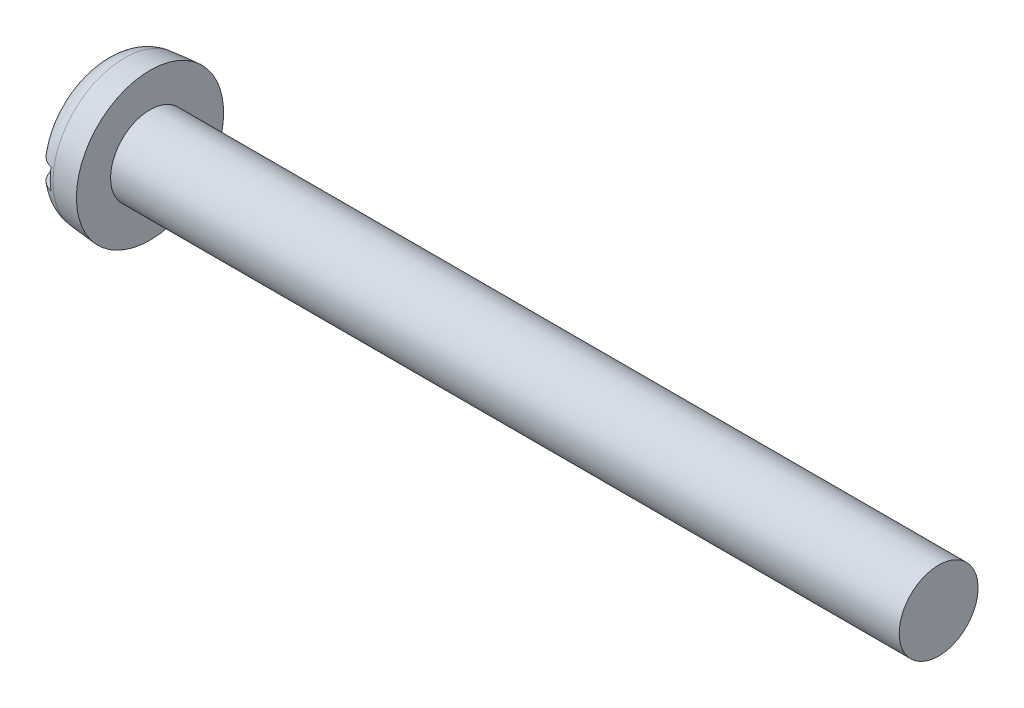
ISO-10303-21;
HEADER;
FILE_DESCRIPTION(('STEP AP214'),'2;1');
FILE_NAME('part.step','',(''),(''),'','','');
FILE_SCHEMA(('AUTOMOTIVE_DESIGN { 1 0 10303 214 1 1 1 1 }'));
ENDSEC;
DATA;
#1=APPLICATION_CONTEXT('core data for automotive mechanical design processes');
#2=APPLICATION_PROTOCOL_DEFINITION('international standard','automotive_design',2000,#1);
#3=PRODUCT_CONTEXT('',#1,'mechanical');
#4=PRODUCT('Part','Part','',(#3));
#5=PRODUCT_RELATED_PRODUCT_CATEGORY('part','',(#4));
#6=PRODUCT_DEFINITION_FORMATION('','',#4);
#7=PRODUCT_DEFINITION_CONTEXT('part definition',#1,'design');
#8=PRODUCT_DEFINITION('design','',#6,#7);
#9=PRODUCT_DEFINITION_SHAPE('','',#8);
#10=(LENGTH_UNIT() NAMED_UNIT(*) SI_UNIT(.MILLI.,.METRE.));
#11=(NAMED_UNIT(*) PLANE_ANGLE_UNIT() SI_UNIT($,.RADIAN.));
#12=(NAMED_UNIT(*) SI_UNIT($,.STERADIAN.) SOLID_ANGLE_UNIT());
#13=UNCERTAINTY_MEASURE_WITH_UNIT(LENGTH_MEASURE(1.E-05),#10,'distance_accuracy_value','');
#14=(GEOMETRIC_REPRESENTATION_CONTEXT(3) GLOBAL_UNCERTAINTY_ASSIGNED_CONTEXT((#13)) GLOBAL_UNIT_ASSIGNED_CONTEXT((#10,
#11,#12)) REPRESENTATION_CONTEXT('',''));
#15=CARTESIAN_POINT('',(0.,0.,0.));
#16=DIRECTION('',(0.,0.,1.));
#17=DIRECTION('',(1.,0.,0.));
#18=AXIS2_PLACEMENT_3D('',#15,#16,#17);
#19=CARTESIAN_POINT('',(0.,0.,0.));
#20=DIRECTION('',(-1.,0.,0.));
#21=DIRECTION('',(0.,0.,1.));
#22=AXIS2_PLACEMENT_3D('',#19,#20,#21);
#23=PLANE('',#22);
#24=DIRECTION('',(0.,0.,-1.));
#25=VECTOR('',#24,1.);
#26=CARTESIAN_POINT('',(0.,0.399999999999999,2.8));
#27=LINE('',#26,#25);
#28=CARTESIAN_POINT('',(0.,0.399999999999999,1.77326763142532));
#29=VERTEX_POINT('',#28);
#30=CARTESIAN_POINT('',(0.,0.399999999999999,-1.77326763142532));
#31=VERTEX_POINT('',#30);
#32=EDGE_CURVE('E91',#29,#31,#27,.T.);
#33=ORIENTED_EDGE('',*,*,#32,.F.);
#34=CARTESIAN_POINT('',(0.,0.,0.));
#35=DIRECTION('',(-1.,0.,0.));
#36=DIRECTION('',(0.,0.,1.));
#37=AXIS2_PLACEMENT_3D('',#34,#35,#36);
#38=CIRCLE('',#37,1.81782234903766);
#39=EDGE_CURVE('E97',#29,#31,#38,.T.);
#40=ORIENTED_EDGE('',*,*,#39,.T.);
#41=EDGE_LOOP('',(#33,#40));
#42=FACE_BOUND('',#41,.T.);
#43=ADVANCED_FACE('F37',(#42),#23,.T.);
#44=CARTESIAN_POINT('',(-25.4,0.,0.));
#45=DIRECTION('',(-1.,0.,0.));
#46=DIRECTION('',(0.,0.,1.));
#47=AXIS2_PLACEMENT_3D('',#44,#45,#46);
#48=CYLINDRICAL_SURFACE('',#47,1.5);
#49=CARTESIAN_POINT('',(31.8,0.,0.));
#50=DIRECTION('',(-1.,0.,0.));
#51=DIRECTION('',(0.,0.,1.));
#52=AXIS2_PLACEMENT_3D('',#49,#50,#51);
#53=CIRCLE('',#52,1.5);
#54=CARTESIAN_POINT('',(31.8,0.,1.5));
#55=VERTEX_POINT('',#54);
#56=EDGE_CURVE('E98',#55,#55,#53,.T.);
#57=ORIENTED_EDGE('',*,*,#56,.T.);
#58=EDGE_LOOP('',(#57));
#59=FACE_BOUND('',#58,.T.);
#60=CARTESIAN_POINT('',(1.8,0.,0.));
#61=DIRECTION('',(-1.,0.,0.));
#62=DIRECTION('',(0.,0.,1.));
#63=AXIS2_PLACEMENT_3D('',#60,#61,#62);
#64=CIRCLE('',#63,1.5);
#65=CARTESIAN_POINT('',(1.8,0.,1.5));
#66=VERTEX_POINT('',#65);
#67=EDGE_CURVE('E158',#66,#66,#64,.T.);
#68=ORIENTED_EDGE('',*,*,#67,.F.);
#69=EDGE_LOOP('',(#68));
#70=FACE_BOUND('',#69,.T.);
#71=ADVANCED_FACE('F146',(#59,#70),#48,.T.);
#72=CARTESIAN_POINT('',(31.8,1.5,0.));
#73=DIRECTION('',(1.,0.,0.));
#74=DIRECTION('',(0.,0.,-1.));
#75=AXIS2_PLACEMENT_3D('',#72,#73,#74);
#76=PLANE('',#75);
#77=ORIENTED_EDGE('',*,*,#56,.F.);
#78=EDGE_LOOP('',(#77));
#79=FACE_BOUND('',#78,.T.);
#80=ADVANCED_FACE('F144',(#79),#76,.T.);
#81=DIRECTION('',(0.,0.,1.));
#82=VECTOR('',#81,1.);
#83=CARTESIAN_POINT('',(0.,-0.4,-2.8));
#84=LINE('',#83,#82);
#85=CARTESIAN_POINT('',(0.,-0.4,-1.77326763142532));
#86=VERTEX_POINT('',#85);
#87=CARTESIAN_POINT('',(0.,-0.4,1.77326763142532));
#88=VERTEX_POINT('',#87);
#89=EDGE_CURVE('E82',#86,#88,#84,.T.);
#90=ORIENTED_EDGE('',*,*,#89,.F.);
#91=EDGE_CURVE('E89',#86,#88,#38,.T.);
#92=ORIENTED_EDGE('',*,*,#91,.T.);
#93=EDGE_LOOP('',(#90,#92));
#94=FACE_BOUND('',#93,.T.);
#95=ADVANCED_FACE('F88',(#94),#23,.T.);
#96=CARTESIAN_POINT('',(0.,0.,0.));
#97=DIRECTION('',(1.,0.,0.));
#98=DIRECTION('',(0.,0.,-1.));
#99=AXIS2_PLACEMENT_3D('',#96,#97,#98);
#100=CONICAL_SURFACE('',#99,2.64252040565334,0.087266462599717);
#101=CARTESIAN_POINT('',(0.821559831527107,0.,0.));
#102=DIRECTION('',(-1.,0.,0.));
#103=DIRECTION('',(0.,0.,1.));
#104=AXIS2_PLACEMENT_3D('',#101,#102,#103);
#105=CIRCLE('',#104,2.71439757732023);
#106=CARTESIAN_POINT('',(0.821559831527107,0.,2.71439757732023));
#107=VERTEX_POINT('',#106);
#108=EDGE_CURVE('E101',#107,#107,#105,.F.);
#109=ORIENTED_EDGE('',*,*,#108,.T.);
#110=EDGE_LOOP('',(#109));
#111=FACE_BOUND('',#110,.T.);
#112=CARTESIAN_POINT('',(1.8,0.,0.));
#113=DIRECTION('',(-1.,0.,0.));
#114=DIRECTION('',(0.,0.,1.));
#115=AXIS2_PLACEMENT_3D('',#112,#113,#114);
#116=CIRCLE('',#115,2.8);
#117=CARTESIAN_POINT('',(1.8,0.,2.8));
#118=VERTEX_POINT('',#117);
#119=EDGE_CURVE('E103',#118,#118,#116,.T.);
#120=ORIENTED_EDGE('',*,*,#119,.T.);
#121=EDGE_LOOP('',(#120));
#122=FACE_BOUND('',#121,.T.);
#123=ADVANCED_FACE('F137',(#111,#122),#100,.T.);
#124=CARTESIAN_POINT('',(1.8,1.5,0.));
#125=DIRECTION('',(-1.,0.,0.));
#126=DIRECTION('',(0.,0.,1.));
#127=AXIS2_PLACEMENT_3D('',#124,#125,#126);
#128=PLANE('',#127);
#129=ORIENTED_EDGE('',*,*,#119,.F.);
#130=EDGE_LOOP('',(#129));
#131=FACE_BOUND('',#130,.T.);
#132=ORIENTED_EDGE('',*,*,#67,.T.);
#133=EDGE_LOOP('',(#132));
#134=FACE_BOUND('',#133,.T.);
#135=ADVANCED_FACE('F133',(#131,#134),#128,.F.);
#136=CARTESIAN_POINT('',(0.9,0.,0.));
#137=DIRECTION('',(-1.,0.,0.));
#138=DIRECTION('',(0.,0.,1.));
#139=AXIS2_PLACEMENT_3D('',#136,#137,#138);
#140=TOROIDAL_SURFACE('',#139,1.81782234903766,0.9);
#141=CARTESIAN_POINT('',(0.401696093511728,0.399999999999999,-2.5359315211413));
#142=CARTESIAN_POINT('',(0.443301117774008,0.399999999999999,-2.56393332788218));
#143=CARTESIAN_POINT('',(0.48728921147468,0.399999999999999,-2.58845843023252));
#144=CARTESIAN_POINT('',(0.578792425576941,0.399999999999999,-2.62980192456992));
#145=CARTESIAN_POINT('',(0.626311517541325,0.399999999999999,-2.64661148109401));
#146=CARTESIAN_POINT('',(0.723491694345221,0.399999999999999,-2.67199528317045));
#147=CARTESIAN_POINT('',(0.77315217005018,0.399999999999999,-2.6805718547261));
#148=CARTESIAN_POINT('',(0.873195470603058,0.399999999999999,-2.68923740018578));
#149=CARTESIAN_POINT('',(0.923578118909892,0.399999999999999,-2.68932841422142));
#150=CARTESIAN_POINT('',(1.02350797374872,0.399999999999999,-2.68103738118982));
#151=CARTESIAN_POINT('',(1.07305702227845,0.399999999999999,-2.67267751789981));
#152=CARTESIAN_POINT('',(1.17005159771854,0.399999999999999,-2.64776531442094));
#153=CARTESIAN_POINT('',(1.21749706154432,0.399999999999999,-2.63121272872072));
#154=CARTESIAN_POINT('',(1.30899463227735,0.399999999999999,-2.59038229907007));
#155=CARTESIAN_POINT('',(1.35304326494453,0.399999999999999,-2.5660966726896));
#156=CARTESIAN_POINT('',(1.43646971838795,0.399999999999999,-2.51051742624853));
#157=CARTESIAN_POINT('',(1.47584746170715,0.399999999999999,-2.47922368999777));
#158=CARTESIAN_POINT('',(1.54908472891299,0.399999999999999,-2.41032419236435));
#159=CARTESIAN_POINT('',(1.58290894495081,0.399999999999999,-2.37268091273685));
#160=CARTESIAN_POINT('',(1.64384285536696,0.399999999999999,-2.29230689336045));
#161=CARTESIAN_POINT('',(1.67095227126419,0.399999999999999,-2.24957594272072));
#162=CARTESIAN_POINT('',(1.71804431058735,0.399999999999999,-2.15971237578419));
#163=CARTESIAN_POINT('',(1.73793948776457,0.399999999999999,-2.11253395536871));
#164=CARTESIAN_POINT('',(1.76968090770725,0.399999999999999,-2.01554593245494));
#165=CARTESIAN_POINT('',(1.78152655521718,0.399999999999999,-1.96573613566218));
#166=CARTESIAN_POINT('',(1.79707863209083,0.399999999999999,-1.86394560462762));
#167=CARTESIAN_POINT('',(1.80063474217523,0.399999999999999,-1.81194193297292));
#168=CARTESIAN_POINT('',(1.79917918253395,0.399999999999999,-1.70805700113295));
#169=CARTESIAN_POINT('',(1.79416652473772,0.399999999999999,-1.65617575575555));
#170=CARTESIAN_POINT('',(1.7755943642346,0.399999999999999,-1.55269446133053));
#171=CARTESIAN_POINT('',(1.76183474132893,0.399999999999999,-1.50113034177219));
#172=CARTESIAN_POINT('',(1.72605722331736,0.399999999999999,-1.40095096381718));
#173=CARTESIAN_POINT('',(1.70403814128862,0.399999999999999,-1.35233613041373));
#174=CARTESIAN_POINT('',(1.65177086981811,0.399999999999999,-1.25824022538736));
#175=CARTESIAN_POINT('',(1.62134113345016,0.399999999999999,-1.21285988807693));
#176=CARTESIAN_POINT('',(1.55331109595649,0.399999999999999,-1.12780932458797));
#177=CARTESIAN_POINT('',(1.51570875984687,0.399999999999999,-1.08814072454133));
#178=CARTESIAN_POINT('',(1.43418773757712,0.399999999999999,-1.01571120097083));
#179=CARTESIAN_POINT('',(1.39025557046043,0.399999999999999,-0.982965398150427));
#180=CARTESIAN_POINT('',(1.29725173640542,0.399999999999999,-0.925820211344956));
#181=CARTESIAN_POINT('',(1.24818246394632,0.399999999999999,-0.901416961201437));
#182=CARTESIAN_POINT('',(1.1492196326343,0.399999999999999,-0.863395366502829));
#183=CARTESIAN_POINT('',(1.09953332116632,0.399999999999999,-0.849240526280142));
#184=CARTESIAN_POINT('',(0.998407326739823,0.399999999999999,-0.830450847570662));
#185=CARTESIAN_POINT('',(0.946969290105794,0.399999999999999,-0.825807308120569));
#186=CARTESIAN_POINT('',(0.84892872096548,0.399999999999999,-0.826338661096804));
#187=CARTESIAN_POINT('',(0.80231923387512,0.399999999999999,-0.830644672645143));
#188=CARTESIAN_POINT('',(0.710503550748047,0.399999999999999,-0.847082675101285));
#189=CARTESIAN_POINT('',(0.665297586491216,0.399999999999999,-0.859215951485934));
#190=CARTESIAN_POINT('',(0.577725921687515,0.399999999999999,-0.890561229701254));
#191=CARTESIAN_POINT('',(0.535345451357801,0.399999999999999,-0.909732336345551));
#192=CARTESIAN_POINT('',(0.454039585142496,0.399999999999999,-0.954356114786257));
#193=CARTESIAN_POINT('',(0.415115190169609,0.399999999999999,-0.979810598293163));
#194=CARTESIAN_POINT('',(0.338258283652574,0.399999999999999,-1.03863563377017));
#195=CARTESIAN_POINT('',(0.300704584388947,0.399999999999999,-1.07250127234658));
#196=CARTESIAN_POINT('',(0.231340396591253,0.399999999999999,-1.14567873524743));
#197=CARTESIAN_POINT('',(0.199531837361427,0.399999999999999,-1.1849923812911));
#198=CARTESIAN_POINT('',(0.140343537062657,0.399999999999999,-1.27100479329441));
#199=CARTESIAN_POINT('',(0.113435239263174,0.399999999999999,-1.31802904125808));
#200=CARTESIAN_POINT('',(0.0677697881199934,0.399999999999999,-1.41588613859262));
#201=CARTESIAN_POINT('',(0.0490135480549558,0.399999999999999,-1.466719413943));
#202=CARTESIAN_POINT('',(0.0200605085740849,0.399999999999999,-1.57150752749652));
#203=CARTESIAN_POINT('',(0.00998112078324515,0.399999999999999,-1.62549494001755));
#204=CARTESIAN_POINT('',(-0.000774459474645266,0.399999999999999,-1.73439964710515));
#205=CARTESIAN_POINT('',(-0.00145178031293704,0.399999999999999,-1.78931682929512));
#206=CARTESIAN_POINT('',(0.00665978805998378,0.399999999999999,-1.8973585349181));
#207=CARTESIAN_POINT('',(0.0152619165789973,0.399999999999999,-1.95049703954292));
#208=CARTESIAN_POINT('',(0.0415044362784367,0.399999999999999,-2.05451158025993));
#209=CARTESIAN_POINT('',(0.0591459771853458,0.399999999999999,-2.10538732765632));
#210=CARTESIAN_POINT('',(0.102479617855353,0.399999999999999,-2.20207106255329));
#211=CARTESIAN_POINT('',(0.127962009730158,0.399999999999999,-2.24797321246302));
#212=CARTESIAN_POINT('',(0.186405952526769,0.399999999999999,-2.3346826673761));
#213=CARTESIAN_POINT('',(0.219357119954584,0.399999999999999,-2.37549692488183));
#214=CARTESIAN_POINT('',(0.277651799171599,0.399999999999999,-2.43611780517026));
#215=CARTESIAN_POINT('',(0.300961246504243,0.399999999999999,-2.45791602542563));
#216=CARTESIAN_POINT('',(0.349758108963351,0.399999999999999,-2.49892172941219));
#217=CARTESIAN_POINT('',(0.375245501851939,0.399999999999999,-2.51812923959063));
#218=CARTESIAN_POINT('',(0.401696093511728,0.399999999999999,-2.5359315211413));
#219=B_SPLINE_CURVE_WITH_KNOTS('',3,(#141,#142,#143,#144,#145,#146,#147,#148,#149,#150,#151,
#152,#153,#154,#155,#156,#157,#158,#159,#160,#161,#162,#163,#164,#165,#166,#167,#168,#169,#170,
#171,#172,#173,#174,#175,#176,#177,#178,#179,#180,#181,#182,#183,#184,#185,#186,#187,#188,#189,
#190,#191,#192,#193,#194,#195,#196,#197,#198,#199,#200,#201,#202,#203,#204,#205,#206,#207,#208,
#209,#210,#211,#212,#213,#214,#215,#216,#217,#218),.UNSPECIFIED.,.T.,.F.,(4,2,2,2,2,2,2,2,2,2,2,
2,2,2,2,2,2,2,2,2,2,2,2,2,2,2,2,2,2,2,2,2,2,2,2,2,2,2,4),(0.,0.150335933494514,
0.300843597394243,0.451308726970357,0.601737681026104,0.751772777865598,0.90181237108013,
1.05200344195132,1.20219700308282,1.35331128753966,1.50443183806961,1.65732734739063,
1.81023416196794,1.96589285940572,2.1215695071664,2.28094272743601,2.44033885916066,
2.60348795607714,2.76668341009569,2.93023171311279,3.09370412047096,3.24783730341248,
3.40182942181944,3.5415702699926,3.68133407374162,3.82029827564248,3.95930259253055,
4.11036263383425,4.26147330942958,4.42325618279748,4.58505717610391,4.74901464634026,
4.9129524393615,5.07365129317271,5.23437059141101,5.39111839087745,5.54764959339694,
5.64322735248863,5.73880413580184),.UNSPECIFIED.);
#220=CARTESIAN_POINT('',(0.7,0.399999999999999,-2.66547244738019));
#221=VERTEX_POINT('',#220);
#222=EDGE_CURVE('E11',#31,#221,#219,.T.);
#223=ORIENTED_EDGE('',*,*,#222,.F.);
#224=ORIENTED_EDGE('',*,*,#39,.F.);
#225=CARTESIAN_POINT('',(0.631175220468883,0.399999999999999,0.871495981540628));
#226=CARTESIAN_POINT('',(0.674904543341188,0.399999999999999,0.856438796500032));
#227=CARTESIAN_POINT('',(0.719878263159747,0.399999999999999,0.844929838444239));
#228=CARTESIAN_POINT('',(0.811135722097473,0.399999999999999,0.829645582358335));
#229=CARTESIAN_POINT('',(0.857419653490011,0.399999999999999,0.825871425436571));
#230=CARTESIAN_POINT('',(0.949967657712768,0.399999999999999,0.826292946243279));
#231=CARTESIAN_POINT('',(0.996231718998188,0.399999999999999,0.830491246695725));
#232=CARTESIAN_POINT('',(1.08739120729822,0.399999999999999,0.846603737630664));
#233=CARTESIAN_POINT('',(1.13228633060722,0.399999999999999,0.858519627443415));
#234=CARTESIAN_POINT('',(1.21961165117638,0.399999999999999,0.889449471124122));
#235=CARTESIAN_POINT('',(1.26203829733493,0.399999999999999,0.908473372222466));
#236=CARTESIAN_POINT('',(1.34345634110222,0.399999999999999,0.952815473313928));
#237=CARTESIAN_POINT('',(1.38244667242382,0.399999999999999,0.978135617780085));
#238=CARTESIAN_POINT('',(1.4594377621541,0.399999999999999,1.03667706350997));
#239=CARTESIAN_POINT('',(1.49706398720202,0.399999999999999,1.07039108297028));
#240=CARTESIAN_POINT('',(1.56659895295036,0.399999999999999,1.14327535241885));
#241=CARTESIAN_POINT('',(1.59850581805068,0.399999999999999,1.18244738484378));
#242=CARTESIAN_POINT('',(1.65794109406934,0.399999999999999,1.26820361081833));
#243=CARTESIAN_POINT('',(1.68499616118368,0.399999999999999,1.31511693869777));
#244=CARTESIAN_POINT('',(1.73097615311023,0.399999999999999,1.41277630231543));
#245=CARTESIAN_POINT('',(1.74990014079754,0.399999999999999,1.46352277904048));
#246=CARTESIAN_POINT('',(1.77921631303595,0.399999999999999,1.56819037296415));
#247=CARTESIAN_POINT('',(1.78948692404479,0.399999999999999,1.62214568122431));
#248=CARTESIAN_POINT('',(1.80062989577949,0.399999999999999,1.73102148257415));
#249=CARTESIAN_POINT('',(1.80150300404476,0.399999999999999,1.78594189854469));
#250=CARTESIAN_POINT('',(1.79377570144154,0.399999999999999,1.89403950300678));
#251=CARTESIAN_POINT('',(1.78535947623962,0.399999999999999,1.94722981003804));
#252=CARTESIAN_POINT('',(1.75948035152466,0.399999999999999,2.05136420293336));
#253=CARTESIAN_POINT('',(1.74201866082191,0.399999999999999,2.10230858794919));
#254=CARTESIAN_POINT('',(1.69903294428936,0.399999999999999,2.1991365537311));
#255=CARTESIAN_POINT('',(1.67372338322898,0.399999999999999,2.24511537218269));
#256=CARTESIAN_POINT('',(1.61559302758182,0.399999999999999,2.33205182310155));
#257=CARTESIAN_POINT('',(1.58277310246186,0.399999999999999,2.37301003595672));
#258=CARTESIAN_POINT('',(1.51127974813898,0.399999999999999,2.44787841079591));
#259=CARTESIAN_POINT('',(1.47273752290481,0.399999999999999,2.48191390856888));
#260=CARTESIAN_POINT('',(1.39041996071933,0.399999999999999,2.54292499319193));
#261=CARTESIAN_POINT('',(1.34664504043414,0.399999999999999,2.5699011416151));
#262=CARTESIAN_POINT('',(1.25574182443869,0.399999999999999,2.61566191750627));
#263=CARTESIAN_POINT('',(1.20866632391598,0.399999999999999,2.63455146707593));
#264=CARTESIAN_POINT('',(1.11199802813735,0.399999999999999,2.66409285611721));
#265=CARTESIAN_POINT('',(1.06240535215686,0.399999999999999,2.67474508552361));
#266=CARTESIAN_POINT('',(0.962502526653357,0.399999999999999,2.68744471269732));
#267=CARTESIAN_POINT('',(0.912200346253431,0.399999999999999,2.68955487726819));
#268=CARTESIAN_POINT('',(0.811958811975335,0.399999999999999,2.68528081529453));
#269=CARTESIAN_POINT('',(0.762019450666034,0.399999999999999,2.67889676322146));
#270=CARTESIAN_POINT('',(0.664027531989639,0.399999999999999,2.65784627208927));
#271=CARTESIAN_POINT('',(0.615971279375598,0.399999999999999,2.643197022474));
#272=CARTESIAN_POINT('',(0.522990210676871,0.399999999999999,2.60606123058607));
#273=CARTESIAN_POINT('',(0.478065406672588,0.399999999999999,2.58357465808084));
#274=CARTESIAN_POINT('',(0.392472109536808,0.399999999999999,2.53134616302211));
#275=CARTESIAN_POINT('',(0.351816515703727,0.399999999999999,2.50158310815031));
#276=CARTESIAN_POINT('',(0.276029509997113,0.399999999999999,2.4357048513604));
#277=CARTESIAN_POINT('',(0.240898244430083,0.399999999999999,2.39958948126101));
#278=CARTESIAN_POINT('',(0.176835333350468,0.399999999999999,2.32172709740984));
#279=CARTESIAN_POINT('',(0.147956836829552,0.399999999999999,2.27993636985612));
#280=CARTESIAN_POINT('',(0.0975151321071611,0.399999999999999,2.19215427977415));
#281=CARTESIAN_POINT('',(0.075952325873937,0.399999999999999,2.14616268660111));
#282=CARTESIAN_POINT('',(0.0404117526562702,0.399999999999999,2.05060031814039));
#283=CARTESIAN_POINT('',(0.0265449840419454,0.399999999999999,2.00098828619734));
#284=CARTESIAN_POINT('',(0.00715737687929576,0.399999999999999,1.90016214005584));
#285=CARTESIAN_POINT('',(0.00163730520276098,0.399999999999999,1.84894787909014));
#286=CARTESIAN_POINT('',(-0.0010364685646481,0.399999999999999,1.74525626284435));
#287=CARTESIAN_POINT('',(0.00198298502720434,0.399999999999999,1.692774471539));
#288=CARTESIAN_POINT('',(0.0165672576861164,0.399999999999999,1.5890162459782));
#289=CARTESIAN_POINT('',(0.0281327748436757,0.399999999999999,1.53773991054426));
#290=CARTESIAN_POINT('',(0.0597928723844847,0.399999999999999,1.43649219995258));
#291=CARTESIAN_POINT('',(0.0800919231210292,0.399999999999999,1.3865847552086));
#292=CARTESIAN_POINT('',(0.128628670781471,0.399999999999999,1.29076759544655));
#293=CARTESIAN_POINT('',(0.156870001205797,0.399999999999999,1.2448597228063));
#294=CARTESIAN_POINT('',(0.221149361739104,0.399999999999999,1.15746425330815));
#295=CARTESIAN_POINT('',(0.257329693538454,0.399999999999999,1.11608124200677));
#296=CARTESIAN_POINT('',(0.336199031863131,0.399999999999999,1.04011285475969));
#297=CARTESIAN_POINT('',(0.378880772489415,0.399999999999999,1.00551998779309));
#298=CARTESIAN_POINT('',(0.45634574482625,0.399999999999999,0.953377181098867));
#299=CARTESIAN_POINT('',(0.489781510585735,0.399999999999999,0.933802963989649));
#300=CARTESIAN_POINT('',(0.558913558209208,0.399999999999999,0.899158166013482));
#301=CARTESIAN_POINT('',(0.594609343085406,0.399999999999999,0.884086599134742));
#302=CARTESIAN_POINT('',(0.631175220468883,0.399999999999999,0.871495981540628));
#303=B_SPLINE_CURVE_WITH_KNOTS('',3,(#225,#226,#227,#228,#229,#230,#231,#232,#233,#234,#235,
#236,#237,#238,#239,#240,#241,#242,#243,#244,#245,#246,#247,#248,#249,#250,#251,#252,#253,#254,
#255,#256,#257,#258,#259,#260,#261,#262,#263,#264,#265,#266,#267,#268,#269,#270,#271,#272,#273,
#274,#275,#276,#277,#278,#279,#280,#281,#282,#283,#284,#285,#286,#287,#288,#289,#290,#291,#292,
#293,#294,#295,#296,#297,#298,#299,#300,#301,#302),.UNSPECIFIED.,.T.,.F.,(4,2,2,2,2,2,2,2,2,2,2,
2,2,2,2,2,2,2,2,2,2,2,2,2,2,2,2,2,2,2,2,2,2,2,2,2,2,2,4),(0.,0.138615612916104,
0.277251674198893,0.415933350916857,0.554645574236207,0.693552648422647,0.832502674767945,
0.983421485118332,1.13438969741741,1.29610427307938,1.45783748170807,1.62180673071881,
1.78576293643649,1.94652574714201,2.10726707950299,2.2639540446038,2.42062287939072,
2.57413636036031,2.72763762557717,2.87908198292273,3.03051917082038,3.18084156107108,
3.33116086374289,3.4811686879926,3.63117709090574,3.78162643331956,3.93207975956823,
4.08376569017546,4.23545995397545,4.38928870771081,4.54313159395465,4.70011617891189,
4.85711358867004,5.01800577434983,5.17897168640496,5.34310060642745,5.50704742574204,
5.62298136153755,5.73888989092701),.UNSPECIFIED.);
#304=CARTESIAN_POINT('',(0.7,0.399999999999999,2.66547244738019));
#305=VERTEX_POINT('',#304);
#306=EDGE_CURVE('E116',#305,#29,#303,.T.);
#307=ORIENTED_EDGE('',*,*,#306,.F.);
#308=CARTESIAN_POINT('',(0.7,0.,0.));
#309=DIRECTION('',(-1.,0.,0.));
#310=DIRECTION('',(0.,0.,1.));
#311=AXIS2_PLACEMENT_3D('',#308,#309,#310);
#312=CIRCLE('',#311,2.69531878777687);
#313=CARTESIAN_POINT('',(0.7,-0.4,2.66547244738019));
#314=VERTEX_POINT('',#313);
#315=EDGE_CURVE('E109',#305,#314,#312,.F.);
#316=ORIENTED_EDGE('',*,*,#315,.T.);
#317=CARTESIAN_POINT('',(0.631175220468883,-0.4,0.871495981540627));
#318=CARTESIAN_POINT('',(0.582440056051628,-0.4,0.888281741940889));
#319=CARTESIAN_POINT('',(0.535174963055644,-0.4,0.909503716497946));
#320=CARTESIAN_POINT('',(0.444903467512748,-0.4,0.959728629210835));
#321=CARTESIAN_POINT('',(0.401907569369314,-0.4,0.988750138784298));
#322=CARTESIAN_POINT('',(0.32139933187422,-0.4,1.05330679583531));
#323=CARTESIAN_POINT('',(0.283866824101226,-0.4,1.08881683540862));
#324=CARTESIAN_POINT('',(0.214947035166147,-0.4,1.16532583126717));
#325=CARTESIAN_POINT('',(0.183557026279774,-0.4,1.20632233747312));
#326=CARTESIAN_POINT('',(0.126173306630207,-0.4,1.29499806178717));
#327=CARTESIAN_POINT('',(0.100543812186154,-0.4,1.34291357063032));
#328=CARTESIAN_POINT('',(0.0575990442880278,-0.4,1.44234685085245));
#329=CARTESIAN_POINT('',(0.0402853165841817,-0.4,1.4938652899135));
#330=CARTESIAN_POINT('',(0.0144295468099869,-0.4,1.59957722380881));
#331=CARTESIAN_POINT('',(0.00597091020770681,-0.4,1.65379120331088));
#332=CARTESIAN_POINT('',(-0.00151505119498214,-0.4,1.76286943896087));
#333=CARTESIAN_POINT('',(-0.000543260661566049,-0.4,1.81773363362998));
#334=CARTESIAN_POINT('',(0.0108063117868818,-0.4,1.92531903415647));
#335=CARTESIAN_POINT('',(0.0209864254781905,-0.4,1.97806105250491));
#336=CARTESIAN_POINT('',(0.0502872770681114,-0.4,2.08100191154855));
#337=CARTESIAN_POINT('',(0.0694067748926922,-0.4,2.13120110391516));
#338=CARTESIAN_POINT('',(0.115513806824551,-0.4,2.22629801812597));
#339=CARTESIAN_POINT('',(0.142292886113339,-0.4,2.27129684027619));
#340=CARTESIAN_POINT('',(0.203167661896692,-0.4,2.3560399758229));
#341=CARTESIAN_POINT('',(0.237262555060447,-0.4,2.39578486536653));
#342=CARTESIAN_POINT('',(0.31107215015185,-0.4,2.46808210682477));
#343=CARTESIAN_POINT('',(0.350664393955092,-0.4,2.50075952492731));
#344=CARTESIAN_POINT('',(0.43483240572609,-0.4,2.55890052234819));
#345=CARTESIAN_POINT('',(0.479407789016665,-0.4,2.5843646579657));
#346=CARTESIAN_POINT('',(0.571659032279253,-0.4,2.62702917155574));
#347=CARTESIAN_POINT('',(0.619288022556019,-0.4,2.64433093880064));
#348=CARTESIAN_POINT('',(0.716785744822631,-0.4,2.67063086398603));
#349=CARTESIAN_POINT('',(0.766654377625563,-0.4,2.67962938927216));
#350=CARTESIAN_POINT('',(0.866851086765477,-0.4,2.68902063968356));
#351=CARTESIAN_POINT('',(0.917173710289188,-0.4,2.68947163706794));
#352=CARTESIAN_POINT('',(1.01717730229026,-0.4,2.68190382365889));
#353=CARTESIAN_POINT('',(1.06685828235616,-0.4,2.67388516605054));
#354=CARTESIAN_POINT('',(1.16408913364714,-0.4,2.64963561785688));
#355=CARTESIAN_POINT('',(1.21164224901621,-0.4,2.63341772685543));
#356=CARTESIAN_POINT('',(1.30336357324319,-0.4,2.5932548985632));
#357=CARTESIAN_POINT('',(1.34753176252252,-0.4,2.56930991658271));
#358=CARTESIAN_POINT('',(1.43140121230963,-0.4,2.51429882511239));
#359=CARTESIAN_POINT('',(1.47108662202344,-0.4,2.48320855787322));
#360=CARTESIAN_POINT('',(1.54472936336671,-0.4,2.41485918396244));
#361=CARTESIAN_POINT('',(1.57868652408327,-0.4,2.3775998932923));
#362=CARTESIAN_POINT('',(1.64024044205203,-0.4,2.29763356977095));
#363=CARTESIAN_POINT('',(1.66777905671271,-0.4,2.2548817982485));
#364=CARTESIAN_POINT('',(1.71540533966796,-0.4,2.16541487025925));
#365=CARTESIAN_POINT('',(1.73549258796613,-0.4,2.11869949056591));
#366=CARTESIAN_POINT('',(1.76797944190081,-0.4,2.02190542768205));
#367=CARTESIAN_POINT('',(1.78026184844694,-0.4,1.97178743470805));
#368=CARTESIAN_POINT('',(1.79642443017794,-0.4,1.87021727726405));
#369=CARTESIAN_POINT('',(1.80030382576996,-0.4,1.81876498945237));
#370=CARTESIAN_POINT('',(1.79965225810416,-0.4,1.71483495243173));
#371=CARTESIAN_POINT('',(1.79494304519989,-0.4,1.66235834857244));
#372=CARTESIAN_POINT('',(1.77700429154566,-0.4,1.55888409709202));
#373=CARTESIAN_POINT('',(1.76377367047763,-0.4,1.50788663784912));
#374=CARTESIAN_POINT('',(1.72880303252309,-0.4,1.40746214507163));
#375=CARTESIAN_POINT('',(1.7068583172022,-0.4,1.35810636780321));
#376=CARTESIAN_POINT('',(1.6551362081094,-0.4,1.2636760290119));
#377=CARTESIAN_POINT('',(1.62535713115486,-0.4,1.21860239032601));
#378=CARTESIAN_POINT('',(1.55817582249343,-0.4,1.13325277423327));
#379=CARTESIAN_POINT('',(1.52065002148733,-0.4,1.09307386688499));
#380=CARTESIAN_POINT('',(1.43925099604234,-0.4,1.01972901550195));
#381=CARTESIAN_POINT('',(1.39537733695676,-0.4,0.986563552070546));
#382=CARTESIAN_POINT('',(1.30343025383384,-0.4,0.929222350042135));
#383=CARTESIAN_POINT('',(1.25547156560025,-0.4,0.904863533629854));
#384=CARTESIAN_POINT('',(1.15587516450286,-0.4,0.865408006374135));
#385=CARTESIAN_POINT('',(1.10423998181313,-0.4,0.850304993129927));
#386=CARTESIAN_POINT('',(1.00351728354307,-0.4,0.831235729727252));
#387=CARTESIAN_POINT('',(0.95458816211606,-0.4,0.826429393731615));
#388=CARTESIAN_POINT('',(0.856720563885969,-0.4,0.825757597618513));
#389=CARTESIAN_POINT('',(0.807782255217161,-0.4,0.8298764112406));
#390=CARTESIAN_POINT('',(0.737839755845569,-0.4,0.842103164129608));
#391=CARTESIAN_POINT('',(0.716186869313666,-0.4,0.846800488735406));
#392=CARTESIAN_POINT('',(0.673323995455611,-0.4,0.857891117601622));
#393=CARTESIAN_POINT('',(0.652113925657396,-0.4,0.86428410295996));
#394=CARTESIAN_POINT('',(0.631175220468883,-0.4,0.871495981540627));
#395=B_SPLINE_CURVE_WITH_KNOTS('',3,(#317,#318,#319,#320,#321,#322,#323,#324,#325,#326,#327,
#328,#329,#330,#331,#332,#333,#334,#335,#336,#337,#338,#339,#340,#341,#342,#343,#344,#345,#346,
#347,#348,#349,#350,#351,#352,#353,#354,#355,#356,#357,#358,#359,#360,#361,#362,#363,#364,#365,
#366,#367,#368,#369,#370,#371,#372,#373,#374,#375,#376,#377,#378,#379,#380,#381,#382,#383,#384,
#385,#386,#387,#388,#389,#390,#391,#392,#393,#394),.UNSPECIFIED.,.T.,.F.,(4,2,2,2,2,2,2,2,2,2,2,
2,2,2,2,2,2,2,2,2,2,2,2,2,2,2,2,2,2,2,2,2,2,2,2,2,2,2,4),(0.,0.154545929505514,
0.309463158544145,0.463793151236126,0.618054453677577,0.780314715588443,0.942605127077751,
1.10641075199289,1.27020101048904,1.43055663497238,1.59089002147255,1.74721863073234,
1.90353008272412,2.0567955472543,2.2100491885017,2.3613455070347,2.51263513171131,
2.66289297461213,2.81314809994484,2.96316574487772,3.11318425745476,3.26371763526343,
3.41425550371989,3.56610818035137,3.71796941486144,3.87206025933958,4.02616539904814,
4.18350533199931,4.3408652159535,4.50216376271748,4.66349699219782,4.82763600715278,
4.99178626625811,5.15229563882414,5.31269559661531,5.45941323508264,5.6058725648985,
5.67228456882568,5.73868409152545),.UNSPECIFIED.);
#396=EDGE_CURVE('E96',#88,#314,#395,.T.);
#397=ORIENTED_EDGE('',*,*,#396,.F.);
#398=ORIENTED_EDGE('',*,*,#91,.F.);
#399=CARTESIAN_POINT('',(0.401696093511728,-0.4,-2.5359315211413));
#400=CARTESIAN_POINT('',(0.359499569861719,-0.4,-2.50752594853869));
#401=CARTESIAN_POINT('',(0.319690458635452,-0.4,-2.47549983982046));
#402=CARTESIAN_POINT('',(0.246006645656666,-0.4,-2.40516587836491));
#403=CARTESIAN_POINT('',(0.212140132740978,-0.4,-2.36684949616946));
#404=CARTESIAN_POINT('',(0.151336229791143,-0.4,-2.28512812362888));
#405=CARTESIAN_POINT('',(0.124391330893495,-0.4,-2.24172872264131));
#406=CARTESIAN_POINT('',(0.0780875903765084,-0.4,-2.15107708021563));
#407=CARTESIAN_POINT('',(0.0587267801702999,-0.4,-2.10382584244335));
#408=CARTESIAN_POINT('',(0.0278574989581019,-0.4,-2.00623443962711));
#409=CARTESIAN_POINT('',(0.0164409014532911,-0.4,-1.95586524023863));
#410=CARTESIAN_POINT('',(0.00203581031766649,-0.4,-1.85393618870856));
#411=CARTESIAN_POINT('',(-0.000951523403916762,-0.4,-1.80237617368877));
#412=CARTESIAN_POINT('',(0.00150541182221349,-0.4,-1.69835894015113));
#413=CARTESIAN_POINT('',(0.00713078743956857,-0.4,-1.64590602749594));
#414=CARTESIAN_POINT('',(0.0268851706508875,-0.4,-1.54262865024755));
#415=CARTESIAN_POINT('',(0.041015234185326,-0.4,-1.49180438869281));
#416=CARTESIAN_POINT('',(0.0777693985439926,-0.4,-1.39187524119994));
#417=CARTESIAN_POINT('',(0.100597428420281,-0.4,-1.34284532896703));
#418=CARTESIAN_POINT('',(0.154028665500749,-0.4,-1.24921236961778));
#419=CARTESIAN_POINT('',(0.184633577370676,-0.4,-1.20461029605316));
#420=CARTESIAN_POINT('',(0.253369835088766,-0.4,-1.12040413132917));
#421=CARTESIAN_POINT('',(0.291615661801268,-0.4,-1.08089328983157));
#422=CARTESIAN_POINT('',(0.37435075888798,-0.4,-1.00902344925026));
#423=CARTESIAN_POINT('',(0.418840522733276,-0.4,-0.976665015956932));
#424=CARTESIAN_POINT('',(0.511731904475918,-0.4,-0.92115376155026));
#425=CARTESIAN_POINT('',(0.56000602416032,-0.4,-0.897788688316841));
#426=CARTESIAN_POINT('',(0.660033558527157,-0.4,-0.860397113393027));
#427=CARTESIAN_POINT('',(0.711783369409339,-0.4,-0.846361098476873));
#428=CARTESIAN_POINT('',(0.812389224940537,-0.4,-0.829368295388297));
#429=CARTESIAN_POINT('',(0.861099258735353,-0.4,-0.825545352440831));
#430=CARTESIAN_POINT('',(0.95840589915131,-0.4,-0.826719597327248));
#431=CARTESIAN_POINT('',(1.00700253299767,-0.4,-0.831714388722303));
#432=CARTESIAN_POINT('',(1.0996760197852,-0.4,-0.84962330141339));
#433=CARTESIAN_POINT('',(1.14384950549969,-0.4,-0.862046867571478));
#434=CARTESIAN_POINT('',(1.22966211525765,-0.4,-0.89374221784771));
#435=CARTESIAN_POINT('',(1.27130051154861,-0.4,-0.913015957700823));
#436=CARTESIAN_POINT('',(1.35338723347829,-0.4,-0.958876506944366));
#437=CARTESIAN_POINT('',(1.39364158740159,-0.4,-0.985809526360112));
#438=CARTESIAN_POINT('',(1.46954671268381,-0.4,-1.04552244383327));
#439=CARTESIAN_POINT('',(1.50519595694897,-0.4,-1.07830427286891));
#440=CARTESIAN_POINT('',(1.5741481223088,-0.4,-1.15198864954587));
#441=CARTESIAN_POINT('',(1.60695638421133,-0.4,-1.19335517911256));
#442=CARTESIAN_POINT('',(1.66548530867698,-0.4,-1.28083525691765));
#443=CARTESIAN_POINT('',(1.69120428590285,-0.4,-1.32694993036066));
#444=CARTESIAN_POINT('',(1.73572700911521,-0.4,-1.42462801939109));
#445=CARTESIAN_POINT('',(1.75421770319601,-0.4,-1.47633466387386));
#446=CARTESIAN_POINT('',(1.78217546204147,-0.4,-1.58213636524115));
#447=CARTESIAN_POINT('',(1.79164262802123,-0.4,-1.63623139532851));
#448=CARTESIAN_POINT('',(1.801118347896,-0.4,-1.74478524431538));
#449=CARTESIAN_POINT('',(1.80120671421375,-0.4,-1.79923704907971));
#450=CARTESIAN_POINT('',(1.79199564422116,-0.4,-1.90734333327446));
#451=CARTESIAN_POINT('',(1.78269735807886,-0.4,-1.96099790957378));
#452=CARTESIAN_POINT('',(1.75522804290983,-0.4,-2.06455754692508));
#453=CARTESIAN_POINT('',(1.73728348499548,-0.4,-2.11452267850709));
#454=CARTESIAN_POINT('',(1.69306568307316,-0.4,-2.21062233517153));
#455=CARTESIAN_POINT('',(1.66679349701772,-0.4,-2.25675734589842));
#456=CARTESIAN_POINT('',(1.60733395224623,-0.4,-2.34276585756036));
#457=CARTESIAN_POINT('',(1.57431956056638,-0.4,-2.38275897803032));
#458=CARTESIAN_POINT('',(1.50194333073533,-0.4,-2.45651788071981));
#459=CARTESIAN_POINT('',(1.46258208977932,-0.4,-2.49028424819412));
#460=CARTESIAN_POINT('',(1.37933549559489,-0.4,-2.55005790908044));
#461=CARTESIAN_POINT('',(1.33553510744259,-0.4,-2.57618357878773));
#462=CARTESIAN_POINT('',(1.24413819843943,-0.4,-2.62062313067504));
#463=CARTESIAN_POINT('',(1.19654207131845,-0.4,-2.63893782183569));
#464=CARTESIAN_POINT('',(1.09942378961358,-0.4,-2.66705979300267));
#465=CARTESIAN_POINT('',(1.0499260157382,-0.4,-2.67695133394454));
#466=CARTESIAN_POINT('',(0.949957006468675,-0.4,-2.68824503862299));
#467=CARTESIAN_POINT('',(0.899485546015457,-0.4,-2.6896452154879));
#468=CARTESIAN_POINT('',(0.799232995516734,-0.4,-2.68392343190627));
#469=CARTESIAN_POINT('',(0.749449974424365,-0.4,-2.67683486710843));
#470=CARTESIAN_POINT('',(0.651826495741724,-0.4,-2.65440372943721));
#471=CARTESIAN_POINT('',(0.603983614927445,-0.4,-2.63907181676455));
#472=CARTESIAN_POINT('',(0.530466612644572,-0.4,-2.60850240808469));
#473=CARTESIAN_POINT('',(0.503717386474933,-0.4,-2.59578274416443));
#474=CARTESIAN_POINT('',(0.45160806054978,-0.4,-2.56776112348693));
#475=CARTESIAN_POINT('',(0.426247954611343,-0.4,-2.55245917822458));
#476=CARTESIAN_POINT('',(0.401696093511728,-0.4,-2.5359315211413));
#477=B_SPLINE_CURVE_WITH_KNOTS('',3,(#399,#400,#401,#402,#403,#404,#405,#406,#407,#408,#409,
#410,#411,#412,#413,#414,#415,#416,#417,#418,#419,#420,#421,#422,#423,#424,#425,#426,#427,#428,
#429,#430,#431,#432,#433,#434,#435,#436,#437,#438,#439,#440,#441,#442,#443,#444,#445,#446,#447,
#448,#449,#450,#451,#452,#453,#454,#455,#456,#457,#458,#459,#460,#461,#462,#463,#464,#465,#466,
#467,#468,#469,#470,#471,#472,#473,#474,#475,#476),.UNSPECIFIED.,.T.,.F.,(4,2,2,2,2,2,2,2,2,2,2,
2,2,2,2,2,2,2,2,2,2,2,2,2,2,2,2,2,2,2,2,2,2,2,2,2,2,2,4),(0.,0.152490218607281,
0.305188944540642,0.457721310022948,0.61021405670459,0.764442291671229,0.91869174818651,
1.07622956938612,1.23378695448846,1.39529155818188,1.55683159371206,1.72100303477019,
1.88518745794618,2.0452166605768,2.2050824234249,2.3508822697905,2.49664249751799,
2.63370136587138,2.77079939621414,2.91549848817681,3.06024544108867,3.21793237831143,
3.37565677021802,3.539607260158,3.70355591107663,3.86610926645174,4.02864270620865,
4.18713298434998,4.34560313574806,4.5004280819907,4.65523846875457,4.80750509346896,
4.95975594414436,5.1104652373745,5.26120979331062,5.41136324663485,5.5613229886773,
5.65004914448152,5.73877490533682),.UNSPECIFIED.);
#478=CARTESIAN_POINT('',(0.7,-0.4,-2.66547244738019));
#479=VERTEX_POINT('',#478);
#480=EDGE_CURVE('E50',#479,#86,#477,.T.);
#481=ORIENTED_EDGE('',*,*,#480,.F.);
#482=EDGE_CURVE('E62',#479,#221,#312,.F.);
#483=ORIENTED_EDGE('',*,*,#482,.T.);
#484=EDGE_LOOP('',(#223,#224,#307,#316,#397,#398,#481,#483));
#485=FACE_BOUND('',#484,.T.);
#486=ORIENTED_EDGE('',*,*,#108,.F.);
#487=EDGE_LOOP('',(#486));
#488=FACE_BOUND('',#487,.T.);
#489=ADVANCED_FACE('F39',(#485,#488),#140,.T.);
#490=CARTESIAN_POINT('',(0.7,0.399999999999999,2.8));
#491=DIRECTION('',(0.,1.,0.));
#492=DIRECTION('',(0.,0.,1.));
#493=AXIS2_PLACEMENT_3D('',#490,#491,#492);
#494=PLANE('',#493);
#495=ORIENTED_EDGE('',*,*,#222,.T.);
#496=DIRECTION('',(0.,0.,-1.));
#497=VECTOR('',#496,1.);
#498=CARTESIAN_POINT('',(0.7,0.399999999999999,2.8));
#499=LINE('',#498,#497);
#500=EDGE_CURVE('E90',#305,#221,#499,.T.);
#501=ORIENTED_EDGE('',*,*,#500,.F.);
#502=ORIENTED_EDGE('',*,*,#306,.T.);
#503=ORIENTED_EDGE('',*,*,#32,.T.);
#504=EDGE_LOOP('',(#495,#501,#502,#503));
#505=FACE_BOUND('',#504,.T.);
#506=ADVANCED_FACE('F124',(#505),#494,.F.);
#507=CARTESIAN_POINT('',(0.7,-0.4,-2.8));
#508=DIRECTION('',(0.,-1.,0.));
#509=DIRECTION('',(0.,0.,-1.));
#510=AXIS2_PLACEMENT_3D('',#507,#508,#509);
#511=PLANE('',#510);
#512=ORIENTED_EDGE('',*,*,#480,.T.);
#513=ORIENTED_EDGE('',*,*,#89,.T.);
#514=ORIENTED_EDGE('',*,*,#396,.T.);
#515=DIRECTION('',(0.,0.,1.));
#516=VECTOR('',#515,1.);
#517=CARTESIAN_POINT('',(0.7,-0.4,-2.8));
#518=LINE('',#517,#516);
#519=EDGE_CURVE('E57',#479,#314,#518,.T.);
#520=ORIENTED_EDGE('',*,*,#519,.F.);
#521=EDGE_LOOP('',(#512,#513,#514,#520));
#522=FACE_BOUND('',#521,.T.);
#523=ADVANCED_FACE('F81',(#522),#511,.F.);
#524=CARTESIAN_POINT('',(0.7,0.399999999999999,-2.8));
#525=DIRECTION('',(-1.,0.,0.));
#526=DIRECTION('',(0.,0.,1.));
#527=AXIS2_PLACEMENT_3D('',#524,#525,#526);
#528=PLANE('',#527);
#529=ORIENTED_EDGE('',*,*,#519,.T.);
#530=ORIENTED_EDGE('',*,*,#315,.F.);
#531=ORIENTED_EDGE('',*,*,#500,.T.);
#532=ORIENTED_EDGE('',*,*,#482,.F.);
#533=EDGE_LOOP('',(#529,#530,#531,#532));
#534=FACE_BOUND('',#533,.T.);
#535=ADVANCED_FACE('F123',(#534),#528,.T.);
#536=CLOSED_SHELL('',(#43,#71,#80,#95,#123,#135,#489,#506,#523,#535));
#537=MANIFOLD_SOLID_BREP('B2',#536);
#538=ADVANCED_BREP_SHAPE_REPRESENTATION('',(#18,#537),#14);
#539=SHAPE_DEFINITION_REPRESENTATION(#9,#538);
ENDSEC;
END-ISO-10303-21;
